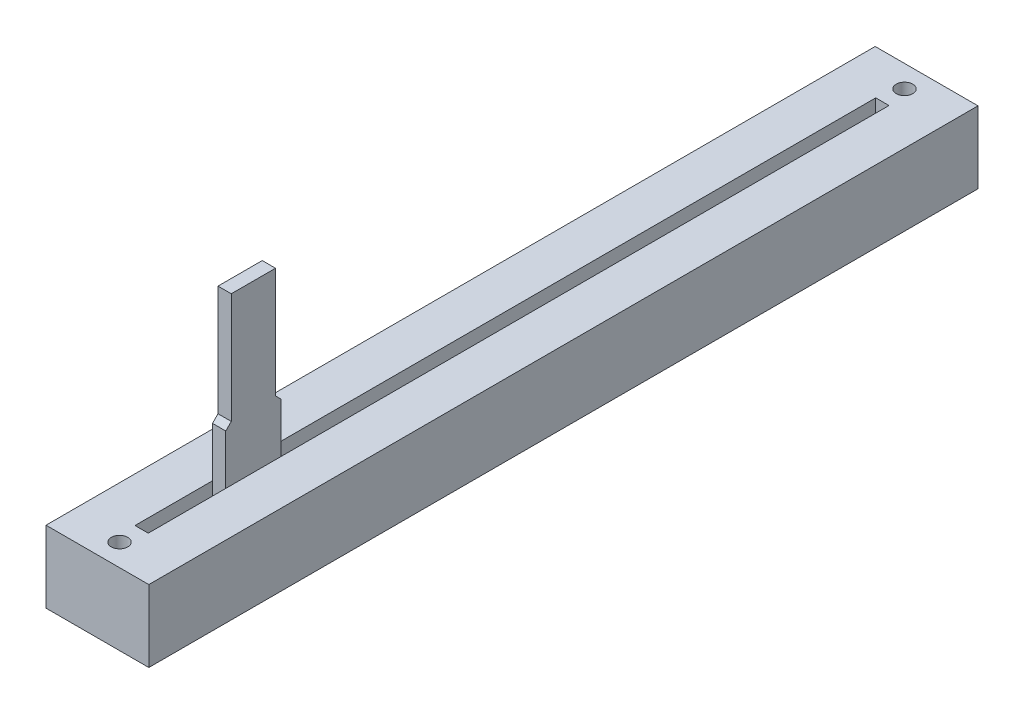
ISO-10303-21;
HEADER;
FILE_DESCRIPTION(('STEP AP214'),'2;1');
FILE_NAME('part.step','',(''),(''),'','','');
FILE_SCHEMA(('AUTOMOTIVE_DESIGN { 1 0 10303 214 1 1 1 1 }'));
ENDSEC;
DATA;
#1=APPLICATION_CONTEXT('core data for automotive mechanical design processes');
#2=APPLICATION_PROTOCOL_DEFINITION('international standard','automotive_design',2000,#1);
#3=PRODUCT_CONTEXT('',#1,'mechanical');
#4=PRODUCT('Part','Part','',(#3));
#5=PRODUCT_RELATED_PRODUCT_CATEGORY('part','',(#4));
#6=PRODUCT_DEFINITION_FORMATION('','',#4);
#7=PRODUCT_DEFINITION_CONTEXT('part definition',#1,'design');
#8=PRODUCT_DEFINITION('design','',#6,#7);
#9=PRODUCT_DEFINITION_SHAPE('','',#8);
#10=(LENGTH_UNIT() NAMED_UNIT(*) SI_UNIT(.MILLI.,.METRE.));
#11=(NAMED_UNIT(*) PLANE_ANGLE_UNIT() SI_UNIT($,.RADIAN.));
#12=(NAMED_UNIT(*) SI_UNIT($,.STERADIAN.) SOLID_ANGLE_UNIT());
#13=UNCERTAINTY_MEASURE_WITH_UNIT(LENGTH_MEASURE(1.E-05),#10,'distance_accuracy_value','');
#14=(GEOMETRIC_REPRESENTATION_CONTEXT(3) GLOBAL_UNCERTAINTY_ASSIGNED_CONTEXT((#13)) GLOBAL_UNIT_ASSIGNED_CONTEXT((#10,
#11,#12)) REPRESENTATION_CONTEXT('',''));
#15=CARTESIAN_POINT('',(0.,0.,0.));
#16=DIRECTION('',(0.,0.,1.));
#17=DIRECTION('',(1.,0.,0.));
#18=AXIS2_PLACEMENT_3D('',#15,#16,#17);
#19=CARTESIAN_POINT('',(-0.600000000000006,2.5,-33.5));
#20=DIRECTION('',(-1.,0.,0.));
#21=DIRECTION('',(0.,0.,1.));
#22=AXIS2_PLACEMENT_3D('',#19,#20,#21);
#23=PLANE('',#22);
#24=DIRECTION('',(0.,-1.,0.));
#25=VECTOR('',#24,1.);
#26=CARTESIAN_POINT('',(-0.6,11.,26.4915869625497));
#27=LINE('',#26,#25);
#28=CARTESIAN_POINT('',(-0.6,6.5,26.4915869625497));
#29=VERTEX_POINT('',#28);
#30=CARTESIAN_POINT('',(-0.6,2.5,26.4915869625497));
#31=VERTEX_POINT('',#30);
#32=EDGE_CURVE('E167',#29,#31,#27,.T.);
#33=ORIENTED_EDGE('',*,*,#32,.F.);
#34=DIRECTION('',(0.,0.,1.));
#35=VECTOR('',#34,1.);
#36=CARTESIAN_POINT('',(-0.600000000000006,6.5,-33.5));
#37=LINE('',#36,#35);
#38=CARTESIAN_POINT('',(-0.599999999999998,6.5,33.5));
#39=VERTEX_POINT('',#38);
#40=EDGE_CURVE('E56',#29,#39,#37,.T.);
#41=ORIENTED_EDGE('',*,*,#40,.T.);
#42=DIRECTION('',(0.,1.,0.));
#43=VECTOR('',#42,1.);
#44=CARTESIAN_POINT('',(-0.599999999999998,2.5,33.5));
#45=LINE('',#44,#43);
#46=CARTESIAN_POINT('',(-0.599999999999998,2.5,33.5));
#47=VERTEX_POINT('',#46);
#48=EDGE_CURVE('E192',#47,#39,#45,.T.);
#49=ORIENTED_EDGE('',*,*,#48,.F.);
#50=DIRECTION('',(0.,0.,1.));
#51=VECTOR('',#50,1.);
#52=CARTESIAN_POINT('',(-0.600000000000006,2.5,-33.5));
#53=LINE('',#52,#51);
#54=EDGE_CURVE('E208',#31,#47,#53,.T.);
#55=ORIENTED_EDGE('',*,*,#54,.F.);
#56=EDGE_LOOP('',(#33,#41,#49,#55));
#57=FACE_BOUND('',#56,.T.);
#58=ADVANCED_FACE('F33',(#57),#23,.F.);
#59=DIRECTION('',(0.,1.,0.));
#60=VECTOR('',#59,1.);
#61=CARTESIAN_POINT('',(-0.6,2.5,21.4915869625497));
#62=LINE('',#61,#60);
#63=CARTESIAN_POINT('',(-0.6,2.5,21.4915869625497));
#64=VERTEX_POINT('',#63);
#65=CARTESIAN_POINT('',(-0.6,6.5,21.4915869625497));
#66=VERTEX_POINT('',#65);
#67=EDGE_CURVE('E559',#64,#66,#62,.T.);
#68=ORIENTED_EDGE('',*,*,#67,.F.);
#69=CARTESIAN_POINT('',(-0.600000000000006,2.5,-33.5));
#70=VERTEX_POINT('',#69);
#71=EDGE_CURVE('E521',#70,#64,#53,.T.);
#72=ORIENTED_EDGE('',*,*,#71,.F.);
#73=DIRECTION('',(0.,1.,0.));
#74=VECTOR('',#73,1.);
#75=CARTESIAN_POINT('',(-0.600000000000006,2.5,-33.5));
#76=LINE('',#75,#74);
#77=CARTESIAN_POINT('',(-0.600000000000006,6.5,-33.5));
#78=VERTEX_POINT('',#77);
#79=EDGE_CURVE('E209',#70,#78,#76,.T.);
#80=ORIENTED_EDGE('',*,*,#79,.T.);
#81=EDGE_CURVE('E197',#78,#66,#37,.T.);
#82=ORIENTED_EDGE('',*,*,#81,.T.);
#83=EDGE_LOOP('',(#68,#72,#80,#82));
#84=FACE_BOUND('',#83,.T.);
#85=ADVANCED_FACE('F282',(#84),#23,.F.);
#86=CARTESIAN_POINT('',(0.599999999999994,2.5,-33.5));
#87=DIRECTION('',(1.,0.,0.));
#88=DIRECTION('',(0.,0.,-1.));
#89=AXIS2_PLACEMENT_3D('',#86,#87,#88);
#90=PLANE('',#89);
#91=DIRECTION('',(0.,-1.,0.));
#92=VECTOR('',#91,1.);
#93=CARTESIAN_POINT('',(0.6,11.,26.4915869625497));
#94=LINE('',#93,#92);
#95=CARTESIAN_POINT('',(0.6,6.5,26.4915869625497));
#96=VERTEX_POINT('',#95);
#97=CARTESIAN_POINT('',(0.6,2.5,26.4915869625497));
#98=VERTEX_POINT('',#97);
#99=EDGE_CURVE('E165',#96,#98,#94,.T.);
#100=ORIENTED_EDGE('',*,*,#99,.T.);
#101=DIRECTION('',(0.,0.,-1.));
#102=VECTOR('',#101,1.);
#103=CARTESIAN_POINT('',(0.599999999999994,2.5,-33.5));
#104=LINE('',#103,#102);
#105=CARTESIAN_POINT('',(0.600000000000002,2.5,33.5));
#106=VERTEX_POINT('',#105);
#107=EDGE_CURVE('E178',#106,#98,#104,.T.);
#108=ORIENTED_EDGE('',*,*,#107,.F.);
#109=DIRECTION('',(0.,1.,0.));
#110=VECTOR('',#109,1.);
#111=CARTESIAN_POINT('',(0.600000000000002,2.5,33.5));
#112=LINE('',#111,#110);
#113=CARTESIAN_POINT('',(0.600000000000002,6.5,33.5));
#114=VERTEX_POINT('',#113);
#115=EDGE_CURVE('E215',#106,#114,#112,.T.);
#116=ORIENTED_EDGE('',*,*,#115,.T.);
#117=DIRECTION('',(0.,0.,-1.));
#118=VECTOR('',#117,1.);
#119=CARTESIAN_POINT('',(0.599999999999994,6.5,-33.5));
#120=LINE('',#119,#118);
#121=EDGE_CURVE('E181',#114,#96,#120,.T.);
#122=ORIENTED_EDGE('',*,*,#121,.T.);
#123=EDGE_LOOP('',(#100,#108,#116,#122));
#124=FACE_BOUND('',#123,.T.);
#125=ADVANCED_FACE('F177',(#124),#90,.F.);
#126=DIRECTION('',(0.,1.,0.));
#127=VECTOR('',#126,1.);
#128=CARTESIAN_POINT('',(0.6,2.5,21.4915869625497));
#129=LINE('',#128,#127);
#130=CARTESIAN_POINT('',(0.6,2.5,21.4915869625497));
#131=VERTEX_POINT('',#130);
#132=CARTESIAN_POINT('',(0.6,6.5,21.4915869625497));
#133=VERTEX_POINT('',#132);
#134=EDGE_CURVE('E48',#131,#133,#129,.T.);
#135=ORIENTED_EDGE('',*,*,#134,.T.);
#136=CARTESIAN_POINT('',(0.599999999999994,6.5,-33.5));
#137=VERTEX_POINT('',#136);
#138=EDGE_CURVE('E203',#133,#137,#120,.T.);
#139=ORIENTED_EDGE('',*,*,#138,.T.);
#140=DIRECTION('',(0.,1.,0.));
#141=VECTOR('',#140,1.);
#142=CARTESIAN_POINT('',(0.599999999999994,2.5,-33.5));
#143=LINE('',#142,#141);
#144=CARTESIAN_POINT('',(0.599999999999994,2.5,-33.5));
#145=VERTEX_POINT('',#144);
#146=EDGE_CURVE('E212',#145,#137,#143,.T.);
#147=ORIENTED_EDGE('',*,*,#146,.F.);
#148=EDGE_CURVE('E189',#131,#145,#104,.T.);
#149=ORIENTED_EDGE('',*,*,#148,.F.);
#150=EDGE_LOOP('',(#135,#139,#147,#149));
#151=FACE_BOUND('',#150,.T.);
#152=ADVANCED_FACE('F461',(#151),#90,.F.);
#153=CARTESIAN_POINT('',(0.,2.5,0.));
#154=DIRECTION('',(0.,1.,0.));
#155=DIRECTION('',(0.,0.,1.));
#156=AXIS2_PLACEMENT_3D('',#153,#154,#155);
#157=PLANE('',#156);
#158=ORIENTED_EDGE('',*,*,#107,.T.);
#159=DIRECTION('',(-1.,0.,0.));
#160=VECTOR('',#159,1.);
#161=CARTESIAN_POINT('',(0.6,2.5,26.4915869625497));
#162=LINE('',#161,#160);
#163=EDGE_CURVE('E160',#98,#31,#162,.T.);
#164=ORIENTED_EDGE('',*,*,#163,.T.);
#165=ORIENTED_EDGE('',*,*,#54,.T.);
#166=DIRECTION('',(1.,0.,0.));
#167=VECTOR('',#166,1.);
#168=CARTESIAN_POINT('',(-0.599999999999998,2.5,33.5));
#169=LINE('',#168,#167);
#170=EDGE_CURVE('E187',#47,#106,#169,.T.);
#171=ORIENTED_EDGE('',*,*,#170,.T.);
#172=EDGE_LOOP('',(#158,#164,#165,#171));
#173=FACE_BOUND('',#172,.T.);
#174=ADVANCED_FACE('F185',(#173),#157,.T.);
#175=ORIENTED_EDGE('',*,*,#71,.T.);
#176=DIRECTION('',(-1.,0.,0.));
#177=VECTOR('',#176,1.);
#178=CARTESIAN_POINT('',(0.6,2.5,21.4915869625497));
#179=LINE('',#178,#177);
#180=EDGE_CURVE('E172',#131,#64,#179,.T.);
#181=ORIENTED_EDGE('',*,*,#180,.F.);
#182=ORIENTED_EDGE('',*,*,#148,.T.);
#183=DIRECTION('',(-1.,0.,0.));
#184=VECTOR('',#183,1.);
#185=CARTESIAN_POINT('',(-0.600000000000006,2.5,-33.5));
#186=LINE('',#185,#184);
#187=EDGE_CURVE('E188',#145,#70,#186,.T.);
#188=ORIENTED_EDGE('',*,*,#187,.T.);
#189=EDGE_LOOP('',(#175,#181,#182,#188));
#190=FACE_BOUND('',#189,.T.);
#191=ADVANCED_FACE('F280',(#190),#157,.T.);
#192=CARTESIAN_POINT('',(-4.65,6.5,37.5));
#193=DIRECTION('',(1.,0.,0.));
#194=DIRECTION('',(0.,0.,-1.));
#195=AXIS2_PLACEMENT_3D('',#192,#193,#194);
#196=PLANE('',#195);
#197=DIRECTION('',(0.,0.,1.));
#198=VECTOR('',#197,1.);
#199=CARTESIAN_POINT('',(-4.65,0.,37.5));
#200=LINE('',#199,#198);
#201=CARTESIAN_POINT('',(-4.65,0.,-37.5));
#202=VERTEX_POINT('',#201);
#203=CARTESIAN_POINT('',(-4.65,0.,37.5));
#204=VERTEX_POINT('',#203);
#205=EDGE_CURVE('E221',#202,#204,#200,.T.);
#206=ORIENTED_EDGE('',*,*,#205,.T.);
#207=DIRECTION('',(0.,-1.,0.));
#208=VECTOR('',#207,1.);
#209=CARTESIAN_POINT('',(-4.65,6.5,37.5));
#210=LINE('',#209,#208);
#211=CARTESIAN_POINT('',(-4.65,6.5,37.5));
#212=VERTEX_POINT('',#211);
#213=EDGE_CURVE('E11',#212,#204,#210,.T.);
#214=ORIENTED_EDGE('',*,*,#213,.F.);
#215=DIRECTION('',(0.,0.,1.));
#216=VECTOR('',#215,1.);
#217=CARTESIAN_POINT('',(-4.65,6.5,37.5));
#218=LINE('',#217,#216);
#219=CARTESIAN_POINT('',(-4.65,6.5,-37.5));
#220=VERTEX_POINT('',#219);
#221=EDGE_CURVE('E230',#220,#212,#218,.T.);
#222=ORIENTED_EDGE('',*,*,#221,.F.);
#223=DIRECTION('',(0.,-1.,0.));
#224=VECTOR('',#223,1.);
#225=CARTESIAN_POINT('',(-4.65,6.5,-37.5));
#226=LINE('',#225,#224);
#227=EDGE_CURVE('E240',#220,#202,#226,.T.);
#228=ORIENTED_EDGE('',*,*,#227,.T.);
#229=EDGE_LOOP('',(#206,#214,#222,#228));
#230=FACE_BOUND('',#229,.T.);
#231=ADVANCED_FACE('F35',(#230),#196,.F.);
#232=CARTESIAN_POINT('',(-4.65,6.5,37.5));
#233=DIRECTION('',(0.,0.,-1.));
#234=DIRECTION('',(-1.,0.,0.));
#235=AXIS2_PLACEMENT_3D('',#232,#233,#234);
#236=PLANE('',#235);
#237=DIRECTION('',(1.,0.,0.));
#238=VECTOR('',#237,1.);
#239=CARTESIAN_POINT('',(-4.65,0.,37.5));
#240=LINE('',#239,#238);
#241=CARTESIAN_POINT('',(4.65,0.,37.5));
#242=VERTEX_POINT('',#241);
#243=EDGE_CURVE('E243',#204,#242,#240,.T.);
#244=ORIENTED_EDGE('',*,*,#243,.T.);
#245=DIRECTION('',(0.,-1.,0.));
#246=VECTOR('',#245,1.);
#247=CARTESIAN_POINT('',(4.65,6.5,37.5));
#248=LINE('',#247,#246);
#249=CARTESIAN_POINT('',(4.65,6.5,37.5));
#250=VERTEX_POINT('',#249);
#251=EDGE_CURVE('E41',#250,#242,#248,.T.);
#252=ORIENTED_EDGE('',*,*,#251,.F.);
#253=DIRECTION('',(1.,0.,0.));
#254=VECTOR('',#253,1.);
#255=CARTESIAN_POINT('',(-4.65,6.5,37.5));
#256=LINE('',#255,#254);
#257=EDGE_CURVE('E233',#212,#250,#256,.T.);
#258=ORIENTED_EDGE('',*,*,#257,.F.);
#259=ORIENTED_EDGE('',*,*,#213,.T.);
#260=EDGE_LOOP('',(#244,#252,#258,#259));
#261=FACE_BOUND('',#260,.T.);
#262=ADVANCED_FACE('F273',(#261),#236,.F.);
#263=CARTESIAN_POINT('',(4.65,6.5,37.5));
#264=DIRECTION('',(-1.,0.,0.));
#265=DIRECTION('',(0.,0.,1.));
#266=AXIS2_PLACEMENT_3D('',#263,#264,#265);
#267=PLANE('',#266);
#268=DIRECTION('',(0.,0.,-1.));
#269=VECTOR('',#268,1.);
#270=CARTESIAN_POINT('',(4.65,0.,37.5));
#271=LINE('',#270,#269);
#272=CARTESIAN_POINT('',(4.65,0.,-37.5));
#273=VERTEX_POINT('',#272);
#274=EDGE_CURVE('E245',#242,#273,#271,.T.);
#275=ORIENTED_EDGE('',*,*,#274,.T.);
#276=DIRECTION('',(0.,-1.,0.));
#277=VECTOR('',#276,1.);
#278=CARTESIAN_POINT('',(4.65,6.5,-37.5));
#279=LINE('',#278,#277);
#280=CARTESIAN_POINT('',(4.65,6.5,-37.5));
#281=VERTEX_POINT('',#280);
#282=EDGE_CURVE('E250',#281,#273,#279,.T.);
#283=ORIENTED_EDGE('',*,*,#282,.F.);
#284=DIRECTION('',(0.,0.,-1.));
#285=VECTOR('',#284,1.);
#286=CARTESIAN_POINT('',(4.65,6.5,37.5));
#287=LINE('',#286,#285);
#288=EDGE_CURVE('E236',#250,#281,#287,.T.);
#289=ORIENTED_EDGE('',*,*,#288,.F.);
#290=ORIENTED_EDGE('',*,*,#251,.T.);
#291=EDGE_LOOP('',(#275,#283,#289,#290));
#292=FACE_BOUND('',#291,.T.);
#293=ADVANCED_FACE('F257',(#292),#267,.F.);
#294=CARTESIAN_POINT('',(-4.65,6.5,-37.5));
#295=DIRECTION('',(0.,0.,1.));
#296=DIRECTION('',(1.,0.,0.));
#297=AXIS2_PLACEMENT_3D('',#294,#295,#296);
#298=PLANE('',#297);
#299=DIRECTION('',(-1.,0.,0.));
#300=VECTOR('',#299,1.);
#301=CARTESIAN_POINT('',(-4.65,0.,-37.5));
#302=LINE('',#301,#300);
#303=EDGE_CURVE('E234',#273,#202,#302,.T.);
#304=ORIENTED_EDGE('',*,*,#303,.T.);
#305=ORIENTED_EDGE('',*,*,#227,.F.);
#306=DIRECTION('',(-1.,0.,0.));
#307=VECTOR('',#306,1.);
#308=CARTESIAN_POINT('',(-4.65,6.5,-37.5));
#309=LINE('',#308,#307);
#310=EDGE_CURVE('E238',#281,#220,#309,.T.);
#311=ORIENTED_EDGE('',*,*,#310,.F.);
#312=ORIENTED_EDGE('',*,*,#282,.T.);
#313=EDGE_LOOP('',(#304,#305,#311,#312));
#314=FACE_BOUND('',#313,.T.);
#315=ADVANCED_FACE('F266',(#314),#298,.F.);
#316=CARTESIAN_POINT('',(0.,6.5,0.));
#317=DIRECTION('',(0.,-1.,0.));
#318=DIRECTION('',(0.,0.,-1.));
#319=AXIS2_PLACEMENT_3D('',#316,#317,#318);
#320=PLANE('',#319);
#321=DIRECTION('',(1.,0.,0.));
#322=VECTOR('',#321,1.);
#323=CARTESIAN_POINT('',(-0.599999999999998,6.5,33.5));
#324=LINE('',#323,#322);
#325=EDGE_CURVE('E200',#39,#114,#324,.T.);
#326=ORIENTED_EDGE('',*,*,#325,.F.);
#327=ORIENTED_EDGE('',*,*,#40,.F.);
#328=DIRECTION('',(0.,0.,1.));
#329=VECTOR('',#328,1.);
#330=CARTESIAN_POINT('',(-0.6,6.5,0.));
#331=LINE('',#330,#329);
#332=EDGE_CURVE('E171',#66,#29,#331,.T.);
#333=ORIENTED_EDGE('',*,*,#332,.F.);
#334=ORIENTED_EDGE('',*,*,#81,.F.);
#335=DIRECTION('',(-1.,0.,0.));
#336=VECTOR('',#335,1.);
#337=CARTESIAN_POINT('',(-0.600000000000006,6.5,-33.5));
#338=LINE('',#337,#336);
#339=EDGE_CURVE('E205',#137,#78,#338,.T.);
#340=ORIENTED_EDGE('',*,*,#339,.F.);
#341=ORIENTED_EDGE('',*,*,#138,.F.);
#342=DIRECTION('',(0.,0.,1.));
#343=VECTOR('',#342,1.);
#344=CARTESIAN_POINT('',(0.6,6.5,0.));
#345=LINE('',#344,#343);
#346=EDGE_CURVE('E526',#133,#96,#345,.T.);
#347=ORIENTED_EDGE('',*,*,#346,.T.);
#348=ORIENTED_EDGE('',*,*,#121,.F.);
#349=EDGE_LOOP('',(#326,#327,#333,#334,#340,#341,#347,#348));
#350=FACE_BOUND('',#349,.T.);
#351=CARTESIAN_POINT('',(0.,6.5,-35.5));
#352=DIRECTION('',(0.,1.,0.));
#353=DIRECTION('',(0.,0.,1.));
#354=AXIS2_PLACEMENT_3D('',#351,#352,#353);
#355=CIRCLE('',#354,0.750000000000001);
#356=CARTESIAN_POINT('',(0.,6.5,-34.75));
#357=VERTEX_POINT('',#356);
#358=EDGE_CURVE('E222',#357,#357,#355,.T.);
#359=ORIENTED_EDGE('',*,*,#358,.F.);
#360=EDGE_LOOP('',(#359));
#361=FACE_BOUND('',#360,.T.);
#362=CARTESIAN_POINT('',(0.,6.5,35.5));
#363=DIRECTION('',(0.,1.,0.));
#364=DIRECTION('',(0.,0.,1.));
#365=AXIS2_PLACEMENT_3D('',#362,#363,#364);
#366=CIRCLE('',#365,0.75);
#367=CARTESIAN_POINT('',(0.,6.5,36.25));
#368=VERTEX_POINT('',#367);
#369=EDGE_CURVE('E211',#368,#368,#366,.T.);
#370=ORIENTED_EDGE('',*,*,#369,.F.);
#371=EDGE_LOOP('',(#370));
#372=FACE_BOUND('',#371,.T.);
#373=ORIENTED_EDGE('',*,*,#221,.T.);
#374=ORIENTED_EDGE('',*,*,#257,.T.);
#375=ORIENTED_EDGE('',*,*,#288,.T.);
#376=ORIENTED_EDGE('',*,*,#310,.T.);
#377=EDGE_LOOP('',(#373,#374,#375,#376));
#378=FACE_BOUND('',#377,.T.);
#379=ADVANCED_FACE('F272',(#350,#361,#372,#378),#320,.F.);
#380=CARTESIAN_POINT('',(0.,0.,0.));
#381=DIRECTION('',(0.,-1.,0.));
#382=DIRECTION('',(0.,0.,-1.));
#383=AXIS2_PLACEMENT_3D('',#380,#381,#382);
#384=PLANE('',#383);
#385=ORIENTED_EDGE('',*,*,#205,.F.);
#386=ORIENTED_EDGE('',*,*,#303,.F.);
#387=ORIENTED_EDGE('',*,*,#274,.F.);
#388=ORIENTED_EDGE('',*,*,#243,.F.);
#389=EDGE_LOOP('',(#385,#386,#387,#388));
#390=FACE_BOUND('',#389,.T.);
#391=ADVANCED_FACE('F263',(#390),#384,.T.);
#392=CARTESIAN_POINT('',(0.,2.5,35.5));
#393=DIRECTION('',(0.,1.,0.));
#394=DIRECTION('',(0.,0.,1.));
#395=AXIS2_PLACEMENT_3D('',#392,#393,#394);
#396=CYLINDRICAL_SURFACE('',#395,0.75);
#397=CARTESIAN_POINT('',(0.,2.5,35.5));
#398=DIRECTION('',(0.,1.,0.));
#399=DIRECTION('',(0.,0.,1.));
#400=AXIS2_PLACEMENT_3D('',#397,#398,#399);
#401=CIRCLE('',#400,0.75);
#402=CARTESIAN_POINT('',(0.,2.5,36.25));
#403=VERTEX_POINT('',#402);
#404=EDGE_CURVE('E225',#403,#403,#401,.T.);
#405=ORIENTED_EDGE('',*,*,#404,.F.);
#406=EDGE_LOOP('',(#405));
#407=FACE_BOUND('',#406,.T.);
#408=ORIENTED_EDGE('',*,*,#369,.T.);
#409=EDGE_LOOP('',(#408));
#410=FACE_BOUND('',#409,.T.);
#411=ADVANCED_FACE('F304',(#407,#410),#396,.F.);
#412=CARTESIAN_POINT('',(0.,2.5,35.5));
#413=DIRECTION('',(0.,1.,0.));
#414=DIRECTION('',(0.,0.,1.));
#415=AXIS2_PLACEMENT_3D('',#412,#413,#414);
#416=PLANE('',#415);
#417=ORIENTED_EDGE('',*,*,#404,.T.);
#418=EDGE_LOOP('',(#417));
#419=FACE_BOUND('',#418,.T.);
#420=ADVANCED_FACE('F300',(#419),#416,.T.);
#421=CARTESIAN_POINT('',(0.,2.5,-35.5));
#422=DIRECTION('',(0.,1.,0.));
#423=DIRECTION('',(0.,0.,1.));
#424=AXIS2_PLACEMENT_3D('',#421,#422,#423);
#425=CYLINDRICAL_SURFACE('',#424,0.750000000000001);
#426=CARTESIAN_POINT('',(0.,2.5,-35.5));
#427=DIRECTION('',(0.,1.,0.));
#428=DIRECTION('',(0.,0.,1.));
#429=AXIS2_PLACEMENT_3D('',#426,#427,#428);
#430=CIRCLE('',#429,0.750000000000001);
#431=CARTESIAN_POINT('',(0.,2.5,-34.75));
#432=VERTEX_POINT('',#431);
#433=EDGE_CURVE('E218',#432,#432,#430,.T.);
#434=ORIENTED_EDGE('',*,*,#433,.F.);
#435=EDGE_LOOP('',(#434));
#436=FACE_BOUND('',#435,.T.);
#437=ORIENTED_EDGE('',*,*,#358,.T.);
#438=EDGE_LOOP('',(#437));
#439=FACE_BOUND('',#438,.T.);
#440=ADVANCED_FACE('F296',(#436,#439),#425,.F.);
#441=CARTESIAN_POINT('',(0.,2.5,-35.5));
#442=DIRECTION('',(0.,1.,0.));
#443=DIRECTION('',(0.,0.,1.));
#444=AXIS2_PLACEMENT_3D('',#441,#442,#443);
#445=PLANE('',#444);
#446=ORIENTED_EDGE('',*,*,#433,.T.);
#447=EDGE_LOOP('',(#446));
#448=FACE_BOUND('',#447,.T.);
#449=ADVANCED_FACE('F292',(#448),#445,.T.);
#450=CARTESIAN_POINT('',(-0.600000000000006,2.5,-33.5));
#451=DIRECTION('',(0.,0.,-1.));
#452=DIRECTION('',(-1.,0.,0.));
#453=AXIS2_PLACEMENT_3D('',#450,#451,#452);
#454=PLANE('',#453);
#455=ORIENTED_EDGE('',*,*,#339,.T.);
#456=ORIENTED_EDGE('',*,*,#79,.F.);
#457=ORIENTED_EDGE('',*,*,#187,.F.);
#458=ORIENTED_EDGE('',*,*,#146,.T.);
#459=EDGE_LOOP('',(#455,#456,#457,#458));
#460=FACE_BOUND('',#459,.T.);
#461=ADVANCED_FACE('F295',(#460),#454,.F.);
#462=CARTESIAN_POINT('',(-0.599999999999998,2.5,33.5));
#463=DIRECTION('',(0.,0.,1.));
#464=DIRECTION('',(1.,0.,0.));
#465=AXIS2_PLACEMENT_3D('',#462,#463,#464);
#466=PLANE('',#465);
#467=ORIENTED_EDGE('',*,*,#325,.T.);
#468=ORIENTED_EDGE('',*,*,#115,.F.);
#469=ORIENTED_EDGE('',*,*,#170,.F.);
#470=ORIENTED_EDGE('',*,*,#48,.T.);
#471=EDGE_LOOP('',(#467,#468,#469,#470));
#472=FACE_BOUND('',#471,.T.);
#473=ADVANCED_FACE('F290',(#472),#466,.F.);
#474=CARTESIAN_POINT('',(0.6,0.,0.));
#475=DIRECTION('',(1.,0.,0.));
#476=DIRECTION('',(0.,0.,-1.));
#477=AXIS2_PLACEMENT_3D('',#474,#475,#476);
#478=PLANE('',#477);
#479=ORIENTED_EDGE('',*,*,#346,.F.);
#480=CARTESIAN_POINT('',(0.6,11.,21.4915869625497));
#481=VERTEX_POINT('',#480);
#482=EDGE_CURVE('E574',#133,#481,#129,.T.);
#483=ORIENTED_EDGE('',*,*,#482,.T.);
#484=DIRECTION('',(0.,0.707106781186547,0.707106781186547));
#485=VECTOR('',#484,1.);
#486=CARTESIAN_POINT('',(0.6,11.,21.4915869625497));
#487=LINE('',#486,#485);
#488=CARTESIAN_POINT('',(0.6,11.5,21.9915869625497));
#489=VERTEX_POINT('',#488);
#490=EDGE_CURVE('E572',#481,#489,#487,.T.);
#491=ORIENTED_EDGE('',*,*,#490,.T.);
#492=DIRECTION('',(0.,1.,0.));
#493=VECTOR('',#492,1.);
#494=CARTESIAN_POINT('',(0.6,11.5,21.9915869625497));
#495=LINE('',#494,#493);
#496=CARTESIAN_POINT('',(0.6,21.5,21.9915869625497));
#497=VERTEX_POINT('',#496);
#498=EDGE_CURVE('E570',#489,#497,#495,.T.);
#499=ORIENTED_EDGE('',*,*,#498,.T.);
#500=DIRECTION('',(0.,0.,1.));
#501=VECTOR('',#500,1.);
#502=CARTESIAN_POINT('',(0.6,21.5,21.9915869625497));
#503=LINE('',#502,#501);
#504=CARTESIAN_POINT('',(0.6,21.5,25.9915869625497));
#505=VERTEX_POINT('',#504);
#506=EDGE_CURVE('E568',#497,#505,#503,.T.);
#507=ORIENTED_EDGE('',*,*,#506,.T.);
#508=DIRECTION('',(0.,-1.,0.));
#509=VECTOR('',#508,1.);
#510=CARTESIAN_POINT('',(0.6,21.5,25.9915869625497));
#511=LINE('',#510,#509);
#512=CARTESIAN_POINT('',(0.6,11.5,25.9915869625497));
#513=VERTEX_POINT('',#512);
#514=EDGE_CURVE('E566',#505,#513,#511,.T.);
#515=ORIENTED_EDGE('',*,*,#514,.T.);
#516=DIRECTION('',(0.,-0.707106781186547,0.707106781186547));
#517=VECTOR('',#516,1.);
#518=CARTESIAN_POINT('',(0.6,11.5,25.9915869625497));
#519=LINE('',#518,#517);
#520=CARTESIAN_POINT('',(0.6,11.,26.4915869625497));
#521=VERTEX_POINT('',#520);
#522=EDGE_CURVE('E549',#513,#521,#519,.T.);
#523=ORIENTED_EDGE('',*,*,#522,.T.);
#524=EDGE_CURVE('E182',#521,#96,#94,.T.);
#525=ORIENTED_EDGE('',*,*,#524,.T.);
#526=EDGE_LOOP('',(#479,#483,#491,#499,#507,#515,#523,#525));
#527=FACE_BOUND('',#526,.T.);
#528=ADVANCED_FACE('F358',(#527),#478,.T.);
#529=CARTESIAN_POINT('',(-0.6,0.,0.));
#530=DIRECTION('',(1.,0.,0.));
#531=DIRECTION('',(0.,0.,-1.));
#532=AXIS2_PLACEMENT_3D('',#529,#530,#531);
#533=PLANE('',#532);
#534=CARTESIAN_POINT('',(-0.6,11.,21.4915869625497));
#535=VERTEX_POINT('',#534);
#536=EDGE_CURVE('E562',#66,#535,#62,.T.);
#537=ORIENTED_EDGE('',*,*,#536,.F.);
#538=ORIENTED_EDGE('',*,*,#332,.T.);
#539=CARTESIAN_POINT('',(-0.6,11.,26.4915869625497));
#540=VERTEX_POINT('',#539);
#541=EDGE_CURVE('E563',#540,#29,#27,.T.);
#542=ORIENTED_EDGE('',*,*,#541,.F.);
#543=DIRECTION('',(0.,-0.707106781186547,0.707106781186547));
#544=VECTOR('',#543,1.);
#545=CARTESIAN_POINT('',(-0.6,11.5,25.9915869625497));
#546=LINE('',#545,#544);
#547=CARTESIAN_POINT('',(-0.6,11.5,25.9915869625497));
#548=VERTEX_POINT('',#547);
#549=EDGE_CURVE('E183',#548,#540,#546,.T.);
#550=ORIENTED_EDGE('',*,*,#549,.F.);
#551=DIRECTION('',(0.,-1.,0.));
#552=VECTOR('',#551,1.);
#553=CARTESIAN_POINT('',(-0.6,21.5,25.9915869625497));
#554=LINE('',#553,#552);
#555=CARTESIAN_POINT('',(-0.6,21.5,25.9915869625497));
#556=VERTEX_POINT('',#555);
#557=EDGE_CURVE('E551',#556,#548,#554,.T.);
#558=ORIENTED_EDGE('',*,*,#557,.F.);
#559=DIRECTION('',(0.,0.,1.));
#560=VECTOR('',#559,1.);
#561=CARTESIAN_POINT('',(-0.6,21.5,21.9915869625497));
#562=LINE('',#561,#560);
#563=CARTESIAN_POINT('',(-0.6,21.5,21.9915869625497));
#564=VERTEX_POINT('',#563);
#565=EDGE_CURVE('E553',#564,#556,#562,.T.);
#566=ORIENTED_EDGE('',*,*,#565,.F.);
#567=DIRECTION('',(0.,1.,0.));
#568=VECTOR('',#567,1.);
#569=CARTESIAN_POINT('',(-0.6,11.5,21.9915869625497));
#570=LINE('',#569,#568);
#571=CARTESIAN_POINT('',(-0.6,11.5,21.9915869625497));
#572=VERTEX_POINT('',#571);
#573=EDGE_CURVE('E555',#572,#564,#570,.T.);
#574=ORIENTED_EDGE('',*,*,#573,.F.);
#575=DIRECTION('',(0.,0.707106781186547,0.707106781186547));
#576=VECTOR('',#575,1.);
#577=CARTESIAN_POINT('',(-0.6,11.,21.4915869625497));
#578=LINE('',#577,#576);
#579=EDGE_CURVE('E557',#535,#572,#578,.T.);
#580=ORIENTED_EDGE('',*,*,#579,.F.);
#581=EDGE_LOOP('',(#537,#538,#542,#550,#558,#566,#574,#580));
#582=FACE_BOUND('',#581,.T.);
#583=ADVANCED_FACE('F364',(#582),#533,.F.);
#584=CARTESIAN_POINT('',(0.6,11.,26.4915869625497));
#585=DIRECTION('',(0.,0.,-1.));
#586=DIRECTION('',(-1.,0.,0.));
#587=AXIS2_PLACEMENT_3D('',#584,#585,#586);
#588=PLANE('',#587);
#589=ORIENTED_EDGE('',*,*,#541,.T.);
#590=ORIENTED_EDGE('',*,*,#32,.T.);
#591=ORIENTED_EDGE('',*,*,#163,.F.);
#592=ORIENTED_EDGE('',*,*,#99,.F.);
#593=ORIENTED_EDGE('',*,*,#524,.F.);
#594=DIRECTION('',(-1.,0.,0.));
#595=VECTOR('',#594,1.);
#596=CARTESIAN_POINT('',(0.6,11.,26.4915869625497));
#597=LINE('',#596,#595);
#598=EDGE_CURVE('E546',#521,#540,#597,.T.);
#599=ORIENTED_EDGE('',*,*,#598,.T.);
#600=EDGE_LOOP('',(#589,#590,#591,#592,#593,#599));
#601=FACE_BOUND('',#600,.T.);
#602=ADVANCED_FACE('F163',(#601),#588,.F.);
#603=CARTESIAN_POINT('',(0.6,2.5,21.4915869625497));
#604=DIRECTION('',(0.,0.,1.));
#605=DIRECTION('',(1.,0.,0.));
#606=AXIS2_PLACEMENT_3D('',#603,#604,#605);
#607=PLANE('',#606);
#608=ORIENTED_EDGE('',*,*,#67,.T.);
#609=ORIENTED_EDGE('',*,*,#536,.T.);
#610=DIRECTION('',(-1.,0.,0.));
#611=VECTOR('',#610,1.);
#612=CARTESIAN_POINT('',(0.6,11.,21.4915869625497));
#613=LINE('',#612,#611);
#614=EDGE_CURVE('E531',#481,#535,#613,.T.);
#615=ORIENTED_EDGE('',*,*,#614,.F.);
#616=ORIENTED_EDGE('',*,*,#482,.F.);
#617=ORIENTED_EDGE('',*,*,#134,.F.);
#618=ORIENTED_EDGE('',*,*,#180,.T.);
#619=EDGE_LOOP('',(#608,#609,#615,#616,#617,#618));
#620=FACE_BOUND('',#619,.T.);
#621=ADVANCED_FACE('F379',(#620),#607,.F.);
#622=CARTESIAN_POINT('',(0.6,11.,21.4915869625497));
#623=DIRECTION('',(0.,-0.707106781186547,0.707106781186547));
#624=DIRECTION('',(0.,-0.707106781186548,-0.707106781186548));
#625=AXIS2_PLACEMENT_3D('',#622,#623,#624);
#626=PLANE('',#625);
#627=ORIENTED_EDGE('',*,*,#579,.T.);
#628=DIRECTION('',(-1.,0.,0.));
#629=VECTOR('',#628,1.);
#630=CARTESIAN_POINT('',(0.6,11.5,21.9915869625497));
#631=LINE('',#630,#629);
#632=EDGE_CURVE('E534',#489,#572,#631,.T.);
#633=ORIENTED_EDGE('',*,*,#632,.F.);
#634=ORIENTED_EDGE('',*,*,#490,.F.);
#635=ORIENTED_EDGE('',*,*,#614,.T.);
#636=EDGE_LOOP('',(#627,#633,#634,#635));
#637=FACE_BOUND('',#636,.T.);
#638=ADVANCED_FACE('F386',(#637),#626,.F.);
#639=CARTESIAN_POINT('',(0.6,11.5,21.9915869625497));
#640=DIRECTION('',(0.,0.,1.));
#641=DIRECTION('',(1.,0.,0.));
#642=AXIS2_PLACEMENT_3D('',#639,#640,#641);
#643=PLANE('',#642);
#644=ORIENTED_EDGE('',*,*,#573,.T.);
#645=DIRECTION('',(-1.,0.,0.));
#646=VECTOR('',#645,1.);
#647=CARTESIAN_POINT('',(0.6,21.5,21.9915869625497));
#648=LINE('',#647,#646);
#649=EDGE_CURVE('E537',#497,#564,#648,.T.);
#650=ORIENTED_EDGE('',*,*,#649,.F.);
#651=ORIENTED_EDGE('',*,*,#498,.F.);
#652=ORIENTED_EDGE('',*,*,#632,.T.);
#653=EDGE_LOOP('',(#644,#650,#651,#652));
#654=FACE_BOUND('',#653,.T.);
#655=ADVANCED_FACE('F393',(#654),#643,.F.);
#656=CARTESIAN_POINT('',(0.6,21.5,21.9915869625497));
#657=DIRECTION('',(0.,-1.,0.));
#658=DIRECTION('',(0.,0.,-1.));
#659=AXIS2_PLACEMENT_3D('',#656,#657,#658);
#660=PLANE('',#659);
#661=ORIENTED_EDGE('',*,*,#565,.T.);
#662=DIRECTION('',(-1.,0.,0.));
#663=VECTOR('',#662,1.);
#664=CARTESIAN_POINT('',(0.6,21.5,25.9915869625497));
#665=LINE('',#664,#663);
#666=EDGE_CURVE('E540',#505,#556,#665,.T.);
#667=ORIENTED_EDGE('',*,*,#666,.F.);
#668=ORIENTED_EDGE('',*,*,#506,.F.);
#669=ORIENTED_EDGE('',*,*,#649,.T.);
#670=EDGE_LOOP('',(#661,#667,#668,#669));
#671=FACE_BOUND('',#670,.T.);
#672=ADVANCED_FACE('F401',(#671),#660,.F.);
#673=CARTESIAN_POINT('',(0.6,21.5,25.9915869625497));
#674=DIRECTION('',(0.,0.,-1.));
#675=DIRECTION('',(-1.,0.,0.));
#676=AXIS2_PLACEMENT_3D('',#673,#674,#675);
#677=PLANE('',#676);
#678=ORIENTED_EDGE('',*,*,#557,.T.);
#679=DIRECTION('',(-1.,0.,0.));
#680=VECTOR('',#679,1.);
#681=CARTESIAN_POINT('',(0.6,11.5,25.9915869625497));
#682=LINE('',#681,#680);
#683=EDGE_CURVE('E543',#513,#548,#682,.T.);
#684=ORIENTED_EDGE('',*,*,#683,.F.);
#685=ORIENTED_EDGE('',*,*,#514,.F.);
#686=ORIENTED_EDGE('',*,*,#666,.T.);
#687=EDGE_LOOP('',(#678,#684,#685,#686));
#688=FACE_BOUND('',#687,.T.);
#689=ADVANCED_FACE('F409',(#688),#677,.F.);
#690=CARTESIAN_POINT('',(0.6,11.5,25.9915869625497));
#691=DIRECTION('',(0.,-0.707106781186547,-0.707106781186547));
#692=DIRECTION('',(0.,0.707106781186548,-0.707106781186548));
#693=AXIS2_PLACEMENT_3D('',#690,#691,#692);
#694=PLANE('',#693);
#695=ORIENTED_EDGE('',*,*,#549,.T.);
#696=ORIENTED_EDGE('',*,*,#598,.F.);
#697=ORIENTED_EDGE('',*,*,#522,.F.);
#698=ORIENTED_EDGE('',*,*,#683,.T.);
#699=EDGE_LOOP('',(#695,#696,#697,#698));
#700=FACE_BOUND('',#699,.T.);
#701=ADVANCED_FACE('F417',(#700),#694,.F.);
#702=CLOSED_SHELL('',(#58,#85,#125,#152,#174,#191,#231,#262,#293,#315,#379,#391,#411,#420,#440,
#449,#461,#473,#528,#583,#602,#621,#638,#655,#672,#689,#701));
#703=MANIFOLD_SOLID_BREP('B2',#702);
#704=ADVANCED_BREP_SHAPE_REPRESENTATION('',(#18,#703),#14);
#705=SHAPE_DEFINITION_REPRESENTATION(#9,#704);
ENDSEC;
END-ISO-10303-21;
